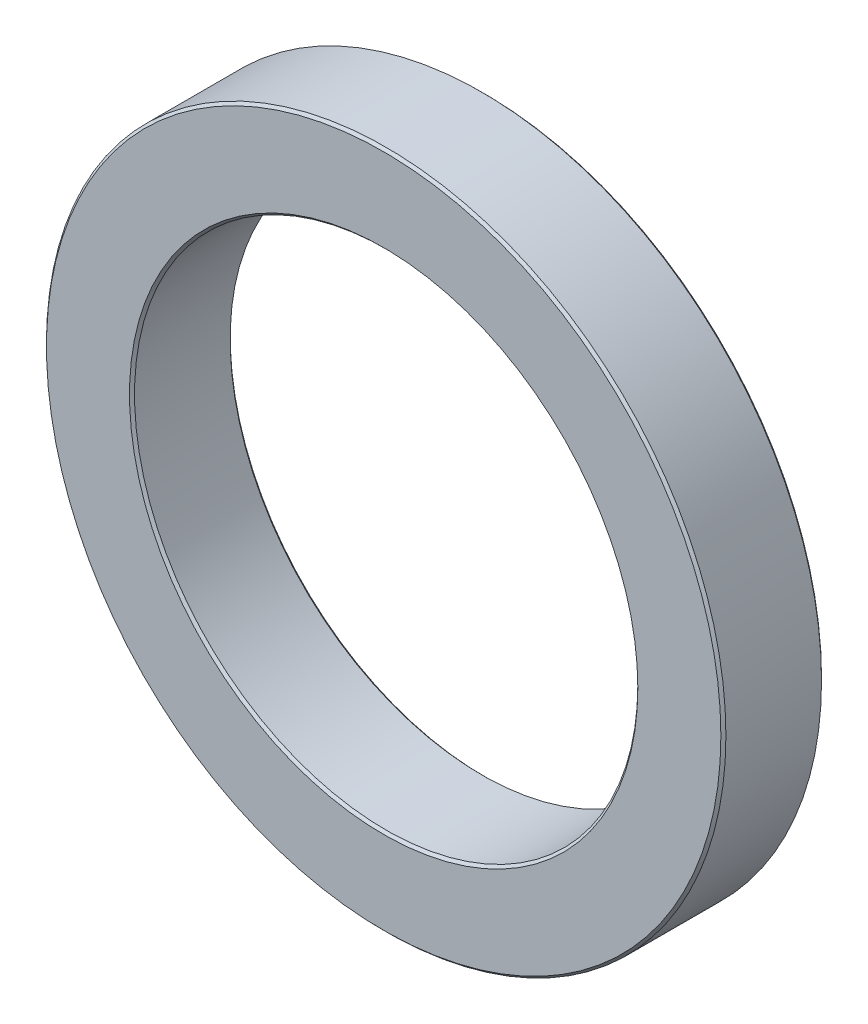
ISO-10303-21;
HEADER;
FILE_DESCRIPTION(('STEP AP214'),'2;1');
FILE_NAME('part.step','',(''),(''),'','','');
FILE_SCHEMA(('AUTOMOTIVE_DESIGN { 1 0 10303 214 1 1 1 1 }'));
ENDSEC;
DATA;
#1=APPLICATION_CONTEXT('core data for automotive mechanical design processes');
#2=APPLICATION_PROTOCOL_DEFINITION('international standard','automotive_design',2000,#1);
#3=PRODUCT_CONTEXT('',#1,'mechanical');
#4=PRODUCT('Part','Part','',(#3));
#5=PRODUCT_RELATED_PRODUCT_CATEGORY('part','',(#4));
#6=PRODUCT_DEFINITION_FORMATION('','',#4);
#7=PRODUCT_DEFINITION_CONTEXT('part definition',#1,'design');
#8=PRODUCT_DEFINITION('design','',#6,#7);
#9=PRODUCT_DEFINITION_SHAPE('','',#8);
#10=(LENGTH_UNIT() NAMED_UNIT(*) SI_UNIT(.MILLI.,.METRE.));
#11=(NAMED_UNIT(*) PLANE_ANGLE_UNIT() SI_UNIT($,.RADIAN.));
#12=(NAMED_UNIT(*) SI_UNIT($,.STERADIAN.) SOLID_ANGLE_UNIT());
#13=UNCERTAINTY_MEASURE_WITH_UNIT(LENGTH_MEASURE(1.E-05),#10,'distance_accuracy_value','');
#14=(GEOMETRIC_REPRESENTATION_CONTEXT(3) GLOBAL_UNCERTAINTY_ASSIGNED_CONTEXT((#13)) GLOBAL_UNIT_ASSIGNED_CONTEXT((#10,
#11,#12)) REPRESENTATION_CONTEXT('',''));
#15=CARTESIAN_POINT('',(0.,0.,0.));
#16=DIRECTION('',(0.,0.,1.));
#17=DIRECTION('',(1.,0.,0.));
#18=AXIS2_PLACEMENT_3D('',#15,#16,#17);
#19=CARTESIAN_POINT('',(0.,0.,4.));
#20=DIRECTION('',(0.,0.,1.));
#21=DIRECTION('',(1.,0.,0.));
#22=AXIS2_PLACEMENT_3D('',#19,#20,#21);
#23=PLANE('',#22);
#24=CARTESIAN_POINT('',(0.,0.,4.));
#25=DIRECTION('',(0.,0.,1.));
#26=DIRECTION('',(1.,0.,0.));
#27=AXIS2_PLACEMENT_3D('',#24,#25,#26);
#28=CIRCLE('',#27,10.1);
#29=CARTESIAN_POINT('',(10.1,0.,4.));
#30=VERTEX_POINT('',#29);
#31=EDGE_CURVE('E62',#30,#30,#28,.F.);
#32=ORIENTED_EDGE('',*,*,#31,.T.);
#33=EDGE_LOOP('',(#32));
#34=FACE_BOUND('',#33,.T.);
#35=CARTESIAN_POINT('',(0.,0.,4.));
#36=DIRECTION('',(0.,0.,1.));
#37=DIRECTION('',(1.,0.,0.));
#38=AXIS2_PLACEMENT_3D('',#35,#36,#37);
#39=CIRCLE('',#38,13.4);
#40=CARTESIAN_POINT('',(13.4,0.,4.));
#41=VERTEX_POINT('',#40);
#42=EDGE_CURVE('E65',#41,#41,#39,.T.);
#43=ORIENTED_EDGE('',*,*,#42,.T.);
#44=EDGE_LOOP('',(#43));
#45=FACE_BOUND('',#44,.T.);
#46=ADVANCED_FACE('F41',(#34,#45),#23,.T.);
#47=CARTESIAN_POINT('',(0.,0.,0.));
#48=DIRECTION('',(0.,0.,1.));
#49=DIRECTION('',(1.,0.,0.));
#50=AXIS2_PLACEMENT_3D('',#47,#48,#49);
#51=PLANE('',#50);
#52=CARTESIAN_POINT('',(0.,0.,0.));
#53=DIRECTION('',(0.,0.,1.));
#54=DIRECTION('',(1.,0.,0.));
#55=AXIS2_PLACEMENT_3D('',#52,#53,#54);
#56=CIRCLE('',#55,10.1);
#57=CARTESIAN_POINT('',(10.1,0.,0.));
#58=VERTEX_POINT('',#57);
#59=EDGE_CURVE('E53',#58,#58,#56,.T.);
#60=ORIENTED_EDGE('',*,*,#59,.T.);
#61=EDGE_LOOP('',(#60));
#62=FACE_BOUND('',#61,.T.);
#63=CARTESIAN_POINT('',(0.,0.,0.));
#64=DIRECTION('',(0.,0.,1.));
#65=DIRECTION('',(1.,0.,0.));
#66=AXIS2_PLACEMENT_3D('',#63,#64,#65);
#67=CIRCLE('',#66,13.4);
#68=CARTESIAN_POINT('',(13.4,0.,0.));
#69=VERTEX_POINT('',#68);
#70=EDGE_CURVE('E57',#69,#69,#67,.F.);
#71=ORIENTED_EDGE('',*,*,#70,.T.);
#72=EDGE_LOOP('',(#71));
#73=FACE_BOUND('',#72,.T.);
#74=ADVANCED_FACE('F85',(#62,#73),#51,.F.);
#75=CARTESIAN_POINT('',(0.,0.,4.));
#76=DIRECTION('',(0.,0.,-1.));
#77=DIRECTION('',(-1.,0.,0.));
#78=AXIS2_PLACEMENT_3D('',#75,#76,#77);
#79=CYLINDRICAL_SURFACE('',#78,13.5);
#80=CARTESIAN_POINT('',(0.,0.,3.9));
#81=DIRECTION('',(0.,0.,1.));
#82=DIRECTION('',(1.,0.,0.));
#83=AXIS2_PLACEMENT_3D('',#80,#81,#82);
#84=CIRCLE('',#83,13.5);
#85=CARTESIAN_POINT('',(13.5,0.,3.9));
#86=VERTEX_POINT('',#85);
#87=EDGE_CURVE('E10',#86,#86,#84,.F.);
#88=ORIENTED_EDGE('',*,*,#87,.T.);
#89=EDGE_LOOP('',(#88));
#90=FACE_BOUND('',#89,.T.);
#91=CARTESIAN_POINT('',(0.,0.,0.0999999999999977));
#92=DIRECTION('',(0.,0.,1.));
#93=DIRECTION('',(1.,0.,0.));
#94=AXIS2_PLACEMENT_3D('',#91,#92,#93);
#95=CIRCLE('',#94,13.5);
#96=CARTESIAN_POINT('',(13.5,0.,0.0999999999999977));
#97=VERTEX_POINT('',#96);
#98=EDGE_CURVE('E49',#97,#97,#95,.T.);
#99=ORIENTED_EDGE('',*,*,#98,.T.);
#100=EDGE_LOOP('',(#99));
#101=FACE_BOUND('',#100,.T.);
#102=ADVANCED_FACE('F88',(#90,#101),#79,.T.);
#103=CARTESIAN_POINT('',(0.,0.,4.));
#104=DIRECTION('',(0.,0.,-1.));
#105=DIRECTION('',(-1.,0.,0.));
#106=AXIS2_PLACEMENT_3D('',#103,#104,#105);
#107=CYLINDRICAL_SURFACE('',#106,10.);
#108=CARTESIAN_POINT('',(0.,0.,3.9));
#109=DIRECTION('',(0.,0.,1.));
#110=DIRECTION('',(1.,0.,0.));
#111=AXIS2_PLACEMENT_3D('',#108,#109,#110);
#112=CIRCLE('',#111,10.);
#113=CARTESIAN_POINT('',(10.,0.,3.9));
#114=VERTEX_POINT('',#113);
#115=EDGE_CURVE('E68',#114,#114,#112,.T.);
#116=ORIENTED_EDGE('',*,*,#115,.T.);
#117=EDGE_LOOP('',(#116));
#118=FACE_BOUND('',#117,.T.);
#119=CARTESIAN_POINT('',(0.,0.,0.100000000000001));
#120=DIRECTION('',(0.,0.,1.));
#121=DIRECTION('',(1.,0.,0.));
#122=AXIS2_PLACEMENT_3D('',#119,#120,#121);
#123=CIRCLE('',#122,10.);
#124=CARTESIAN_POINT('',(10.,0.,0.100000000000001));
#125=VERTEX_POINT('',#124);
#126=EDGE_CURVE('E71',#125,#125,#123,.F.);
#127=ORIENTED_EDGE('',*,*,#126,.T.);
#128=EDGE_LOOP('',(#127));
#129=FACE_BOUND('',#128,.T.);
#130=ADVANCED_FACE('F75',(#118,#129),#107,.F.);
#131=CARTESIAN_POINT('',(0.,0.,3.9));
#132=DIRECTION('',(0.,0.,1.));
#133=DIRECTION('',(1.,0.,0.));
#134=AXIS2_PLACEMENT_3D('',#131,#132,#133);
#135=CONICAL_SURFACE('',#134,10.,0.785398163397466);
#136=ORIENTED_EDGE('',*,*,#31,.F.);
#137=EDGE_LOOP('',(#136));
#138=FACE_BOUND('',#137,.T.);
#139=ORIENTED_EDGE('',*,*,#115,.F.);
#140=EDGE_LOOP('',(#139));
#141=FACE_BOUND('',#140,.T.);
#142=ADVANCED_FACE('F81',(#138,#141),#135,.F.);
#143=CARTESIAN_POINT('',(0.,0.,0.));
#144=DIRECTION('',(0.,0.,-1.));
#145=DIRECTION('',(-1.,0.,0.));
#146=AXIS2_PLACEMENT_3D('',#143,#144,#145);
#147=CONICAL_SURFACE('',#146,10.1,0.785398163397466);
#148=ORIENTED_EDGE('',*,*,#126,.F.);
#149=EDGE_LOOP('',(#148));
#150=FACE_BOUND('',#149,.T.);
#151=ORIENTED_EDGE('',*,*,#59,.F.);
#152=EDGE_LOOP('',(#151));
#153=FACE_BOUND('',#152,.T.);
#154=ADVANCED_FACE('F77',(#150,#153),#147,.F.);
#155=CARTESIAN_POINT('',(0.,0.,4.));
#156=DIRECTION('',(0.,0.,-1.));
#157=DIRECTION('',(-1.,0.,0.));
#158=AXIS2_PLACEMENT_3D('',#155,#156,#157);
#159=CONICAL_SURFACE('',#158,13.4,0.785398163397474);
#160=ORIENTED_EDGE('',*,*,#87,.F.);
#161=EDGE_LOOP('',(#160));
#162=FACE_BOUND('',#161,.T.);
#163=ORIENTED_EDGE('',*,*,#42,.F.);
#164=EDGE_LOOP('',(#163));
#165=FACE_BOUND('',#164,.T.);
#166=ADVANCED_FACE('F80',(#162,#165),#159,.T.);
#167=CARTESIAN_POINT('',(0.,0.,0.0999999999999977));
#168=DIRECTION('',(0.,0.,1.));
#169=DIRECTION('',(1.,0.,0.));
#170=AXIS2_PLACEMENT_3D('',#167,#168,#169);
#171=CONICAL_SURFACE('',#170,13.5,0.785398163397457);
#172=ORIENTED_EDGE('',*,*,#70,.F.);
#173=EDGE_LOOP('',(#172));
#174=FACE_BOUND('',#173,.T.);
#175=ORIENTED_EDGE('',*,*,#98,.F.);
#176=EDGE_LOOP('',(#175));
#177=FACE_BOUND('',#176,.T.);
#178=ADVANCED_FACE('F44',(#174,#177),#171,.T.);
#179=CLOSED_SHELL('',(#46,#74,#102,#130,#142,#154,#166,#178));
#180=MANIFOLD_SOLID_BREP('B2',#179);
#181=ADVANCED_BREP_SHAPE_REPRESENTATION('',(#18,#180),#14);
#182=SHAPE_DEFINITION_REPRESENTATION(#9,#181);
ENDSEC;
END-ISO-10303-21;
